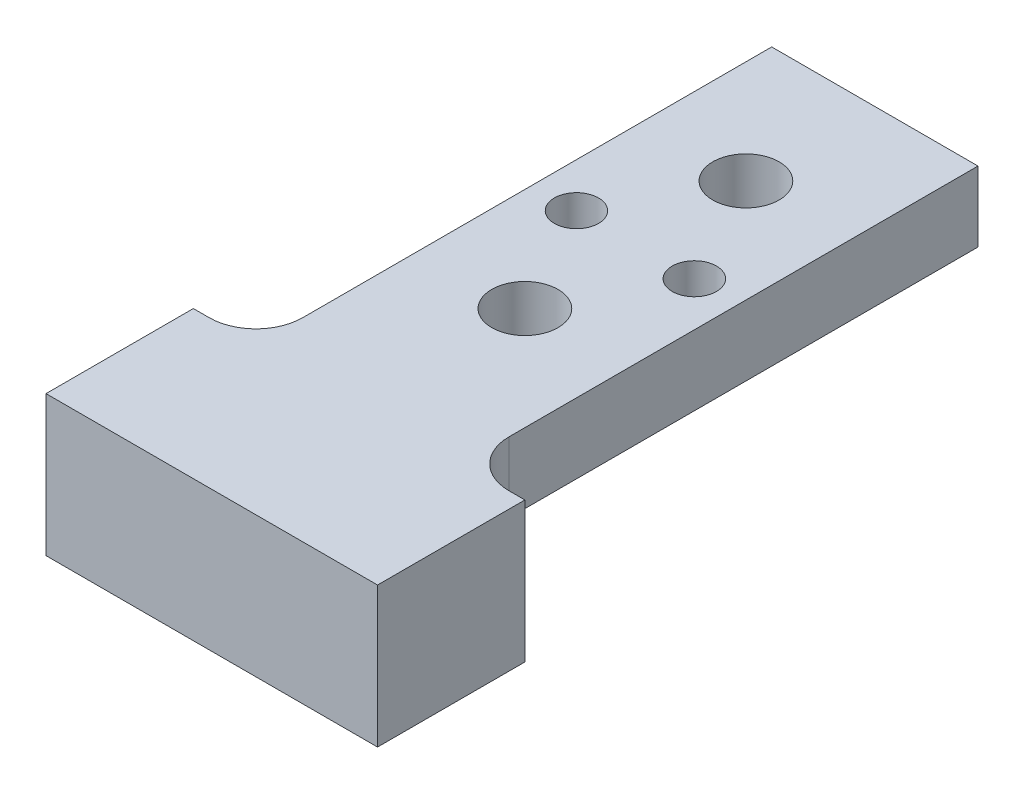
ISO-10303-21;
HEADER;
FILE_DESCRIPTION(('STEP AP214'),'2;1');
FILE_NAME('part.step','',(''),(''),'','','');
FILE_SCHEMA(('AUTOMOTIVE_DESIGN { 1 0 10303 214 1 1 1 1 }'));
ENDSEC;
DATA;
#1=APPLICATION_CONTEXT('core data for automotive mechanical design processes');
#2=APPLICATION_PROTOCOL_DEFINITION('international standard','automotive_design',2000,#1);
#3=PRODUCT_CONTEXT('',#1,'mechanical');
#4=PRODUCT('Part','Part','',(#3));
#5=PRODUCT_RELATED_PRODUCT_CATEGORY('part','',(#4));
#6=PRODUCT_DEFINITION_FORMATION('','',#4);
#7=PRODUCT_DEFINITION_CONTEXT('part definition',#1,'design');
#8=PRODUCT_DEFINITION('design','',#6,#7);
#9=PRODUCT_DEFINITION_SHAPE('','',#8);
#10=(LENGTH_UNIT() NAMED_UNIT(*) SI_UNIT(.MILLI.,.METRE.));
#11=(NAMED_UNIT(*) PLANE_ANGLE_UNIT() SI_UNIT($,.RADIAN.));
#12=(NAMED_UNIT(*) SI_UNIT($,.STERADIAN.) SOLID_ANGLE_UNIT());
#13=UNCERTAINTY_MEASURE_WITH_UNIT(LENGTH_MEASURE(1.E-05),#10,'distance_accuracy_value','');
#14=(GEOMETRIC_REPRESENTATION_CONTEXT(3) GLOBAL_UNCERTAINTY_ASSIGNED_CONTEXT((#13)) GLOBAL_UNIT_ASSIGNED_CONTEXT((#10,
#11,#12)) REPRESENTATION_CONTEXT('',''));
#15=CARTESIAN_POINT('',(0.,0.,0.));
#16=DIRECTION('',(0.,0.,1.));
#17=DIRECTION('',(1.,0.,0.));
#18=AXIS2_PLACEMENT_3D('',#15,#16,#17);
#19=CARTESIAN_POINT('',(-22.5,9.525,-45.));
#20=DIRECTION('',(1.,0.,0.));
#21=DIRECTION('',(0.,0.,-1.));
#22=AXIS2_PLACEMENT_3D('',#19,#20,#21);
#23=PLANE('',#22);
#24=DIRECTION('',(0.,0.,1.));
#25=VECTOR('',#24,1.);
#26=CARTESIAN_POINT('',(-22.5,9.525,-45.));
#27=LINE('',#26,#25);
#28=CARTESIAN_POINT('',(-22.5,9.525,25.));
#29=VERTEX_POINT('',#28);
#30=CARTESIAN_POINT('',(-22.5,9.525,45.));
#31=VERTEX_POINT('',#30);
#32=EDGE_CURVE('E150',#29,#31,#27,.T.);
#33=ORIENTED_EDGE('',*,*,#32,.F.);
#34=DIRECTION('',(0.,-1.,0.));
#35=VECTOR('',#34,1.);
#36=CARTESIAN_POINT('',(-22.5,-9.52500000000001,25.));
#37=LINE('',#36,#35);
#38=CARTESIAN_POINT('',(-22.5,-9.52500000000001,25.));
#39=VERTEX_POINT('',#38);
#40=EDGE_CURVE('E198',#29,#39,#37,.T.);
#41=ORIENTED_EDGE('',*,*,#40,.T.);
#42=DIRECTION('',(0.,0.,1.));
#43=VECTOR('',#42,1.);
#44=CARTESIAN_POINT('',(-22.5,-9.525,-45.));
#45=LINE('',#44,#43);
#46=CARTESIAN_POINT('',(-22.5,-9.525,45.));
#47=VERTEX_POINT('',#46);
#48=EDGE_CURVE('E143',#39,#47,#45,.T.);
#49=ORIENTED_EDGE('',*,*,#48,.T.);
#50=DIRECTION('',(0.,-1.,0.));
#51=VECTOR('',#50,1.);
#52=CARTESIAN_POINT('',(-22.5,9.525,45.));
#53=LINE('',#52,#51);
#54=EDGE_CURVE('E136',#31,#47,#53,.T.);
#55=ORIENTED_EDGE('',*,*,#54,.F.);
#56=EDGE_LOOP('',(#33,#41,#49,#55));
#57=FACE_BOUND('',#56,.T.);
#58=ADVANCED_FACE('F34',(#57),#23,.F.);
#59=CARTESIAN_POINT('',(-22.5,9.525,45.));
#60=DIRECTION('',(0.,0.,-1.));
#61=DIRECTION('',(-1.,0.,0.));
#62=AXIS2_PLACEMENT_3D('',#59,#60,#61);
#63=PLANE('',#62);
#64=DIRECTION('',(1.,0.,0.));
#65=VECTOR('',#64,1.);
#66=CARTESIAN_POINT('',(-22.5,-9.525,45.));
#67=LINE('',#66,#65);
#68=CARTESIAN_POINT('',(22.5,-9.525,45.));
#69=VERTEX_POINT('',#68);
#70=EDGE_CURVE('E145',#47,#69,#67,.T.);
#71=ORIENTED_EDGE('',*,*,#70,.T.);
#72=DIRECTION('',(0.,-1.,0.));
#73=VECTOR('',#72,1.);
#74=CARTESIAN_POINT('',(22.5,9.525,45.));
#75=LINE('',#74,#73);
#76=CARTESIAN_POINT('',(22.5,9.525,45.));
#77=VERTEX_POINT('',#76);
#78=EDGE_CURVE('E132',#77,#69,#75,.T.);
#79=ORIENTED_EDGE('',*,*,#78,.F.);
#80=DIRECTION('',(1.,0.,0.));
#81=VECTOR('',#80,1.);
#82=CARTESIAN_POINT('',(-22.5,9.525,45.));
#83=LINE('',#82,#81);
#84=EDGE_CURVE('E139',#31,#77,#83,.T.);
#85=ORIENTED_EDGE('',*,*,#84,.F.);
#86=ORIENTED_EDGE('',*,*,#54,.T.);
#87=EDGE_LOOP('',(#71,#79,#85,#86));
#88=FACE_BOUND('',#87,.T.);
#89=ADVANCED_FACE('F215',(#88),#63,.F.);
#90=CARTESIAN_POINT('',(22.5,9.525,-45.));
#91=DIRECTION('',(-1.,0.,0.));
#92=DIRECTION('',(0.,0.,1.));
#93=AXIS2_PLACEMENT_3D('',#90,#91,#92);
#94=PLANE('',#93);
#95=DIRECTION('',(0.,-1.,0.));
#96=VECTOR('',#95,1.);
#97=CARTESIAN_POINT('',(22.5,-9.52500000000001,25.));
#98=LINE('',#97,#96);
#99=CARTESIAN_POINT('',(22.5,9.525,25.));
#100=VERTEX_POINT('',#99);
#101=CARTESIAN_POINT('',(22.5,-9.525,25.));
#102=VERTEX_POINT('',#101);
#103=EDGE_CURVE('E197',#100,#102,#98,.T.);
#104=ORIENTED_EDGE('',*,*,#103,.F.);
#105=DIRECTION('',(0.,0.,-1.));
#106=VECTOR('',#105,1.);
#107=CARTESIAN_POINT('',(22.5,9.525,-45.));
#108=LINE('',#107,#106);
#109=EDGE_CURVE('E133',#77,#100,#108,.T.);
#110=ORIENTED_EDGE('',*,*,#109,.F.);
#111=ORIENTED_EDGE('',*,*,#78,.T.);
#112=DIRECTION('',(0.,0.,-1.));
#113=VECTOR('',#112,1.);
#114=CARTESIAN_POINT('',(22.5,-9.525,-45.));
#115=LINE('',#114,#113);
#116=EDGE_CURVE('E148',#69,#102,#115,.T.);
#117=ORIENTED_EDGE('',*,*,#116,.T.);
#118=EDGE_LOOP('',(#104,#110,#111,#117));
#119=FACE_BOUND('',#118,.T.);
#120=ADVANCED_FACE('F220',(#119),#94,.F.);
#121=CARTESIAN_POINT('',(-22.5,9.525,-45.));
#122=DIRECTION('',(0.,0.,1.));
#123=DIRECTION('',(1.,0.,0.));
#124=AXIS2_PLACEMENT_3D('',#121,#122,#123);
#125=PLANE('',#124);
#126=DIRECTION('',(-1.,0.,0.));
#127=VECTOR('',#126,1.);
#128=CARTESIAN_POINT('',(-22.5,9.525,-45.));
#129=LINE('',#128,#127);
#130=CARTESIAN_POINT('',(14.,9.525,-45.));
#131=VERTEX_POINT('',#130);
#132=CARTESIAN_POINT('',(-14.,9.525,-45.));
#133=VERTEX_POINT('',#132);
#134=EDGE_CURVE('E125',#131,#133,#129,.T.);
#135=ORIENTED_EDGE('',*,*,#134,.F.);
#136=DIRECTION('',(0.,1.,0.));
#137=VECTOR('',#136,1.);
#138=CARTESIAN_POINT('',(14.,-9.52500000000001,-45.));
#139=LINE('',#138,#137);
#140=CARTESIAN_POINT('',(14.,0.,-45.));
#141=VERTEX_POINT('',#140);
#142=EDGE_CURVE('E111',#141,#131,#139,.T.);
#143=ORIENTED_EDGE('',*,*,#142,.F.);
#144=DIRECTION('',(1.,0.,0.));
#145=VECTOR('',#144,1.);
#146=CARTESIAN_POINT('',(-22.5,0.,-45.));
#147=LINE('',#146,#145);
#148=CARTESIAN_POINT('',(-14.,0.,-45.));
#149=VERTEX_POINT('',#148);
#150=EDGE_CURVE('E201',#149,#141,#147,.T.);
#151=ORIENTED_EDGE('',*,*,#150,.F.);
#152=DIRECTION('',(0.,1.,0.));
#153=VECTOR('',#152,1.);
#154=CARTESIAN_POINT('',(-14.,-9.52500000000001,-45.));
#155=LINE('',#154,#153);
#156=EDGE_CURVE('E131',#149,#133,#155,.T.);
#157=ORIENTED_EDGE('',*,*,#156,.T.);
#158=EDGE_LOOP('',(#135,#143,#151,#157));
#159=FACE_BOUND('',#158,.T.);
#160=ADVANCED_FACE('F129',(#159),#125,.F.);
#161=CARTESIAN_POINT('',(-22.5,9.525,45.));
#162=DIRECTION('',(0.,1.,0.));
#163=DIRECTION('',(0.,0.,1.));
#164=AXIS2_PLACEMENT_3D('',#161,#162,#163);
#165=PLANE('',#164);
#166=CARTESIAN_POINT('',(-1.11022302462516E-13,9.525,-27.4999999999999));
#167=DIRECTION('',(0.,1.,0.));
#168=DIRECTION('',(0.,0.,1.));
#169=AXIS2_PLACEMENT_3D('',#166,#167,#168);
#170=CIRCLE('',#169,4.49999999999999);
#171=CARTESIAN_POINT('',(-1.11022302462516E-13,9.525,-22.9999999999999));
#172=VERTEX_POINT('',#171);
#173=EDGE_CURVE('E287',#172,#172,#170,.T.);
#174=ORIENTED_EDGE('',*,*,#173,.F.);
#175=EDGE_LOOP('',(#174));
#176=FACE_BOUND('',#175,.T.);
#177=CARTESIAN_POINT('',(-1.11022302462516E-13,9.525,2.50000000000011));
#178=DIRECTION('',(0.,1.,0.));
#179=DIRECTION('',(0.,0.,1.));
#180=AXIS2_PLACEMENT_3D('',#177,#178,#179);
#181=CIRCLE('',#180,4.49999999999999);
#182=CARTESIAN_POINT('',(-1.11022302462516E-13,9.525,7.0000000000001));
#183=VERTEX_POINT('',#182);
#184=EDGE_CURVE('E187',#183,#183,#181,.T.);
#185=ORIENTED_EDGE('',*,*,#184,.F.);
#186=EDGE_LOOP('',(#185));
#187=FACE_BOUND('',#186,.T.);
#188=CARTESIAN_POINT('',(7.9999999999999,9.525,-12.5));
#189=DIRECTION('',(0.,1.,0.));
#190=DIRECTION('',(0.,0.,1.));
#191=AXIS2_PLACEMENT_3D('',#188,#189,#190);
#192=CIRCLE('',#191,2.99999999999999);
#193=CARTESIAN_POINT('',(7.9999999999999,9.525,-9.50000000000002));
#194=VERTEX_POINT('',#193);
#195=EDGE_CURVE('E176',#194,#194,#192,.T.);
#196=ORIENTED_EDGE('',*,*,#195,.F.);
#197=EDGE_LOOP('',(#196));
#198=FACE_BOUND('',#197,.T.);
#199=CARTESIAN_POINT('',(-8.00000000000012,9.525,-12.5));
#200=DIRECTION('',(0.,1.,0.));
#201=DIRECTION('',(0.,0.,1.));
#202=AXIS2_PLACEMENT_3D('',#199,#200,#201);
#203=CIRCLE('',#202,2.99999999999999);
#204=CARTESIAN_POINT('',(-8.00000000000012,9.525,-9.50000000000002));
#205=VERTEX_POINT('',#204);
#206=EDGE_CURVE('E173',#205,#205,#203,.T.);
#207=ORIENTED_EDGE('',*,*,#206,.F.);
#208=EDGE_LOOP('',(#207));
#209=FACE_BOUND('',#208,.T.);
#210=DIRECTION('',(1.,0.,0.));
#211=VECTOR('',#210,1.);
#212=CARTESIAN_POINT('',(22.5,9.525,25.));
#213=LINE('',#212,#211);
#214=CARTESIAN_POINT('',(20.35,9.525,25.));
#215=VERTEX_POINT('',#214);
#216=EDGE_CURVE('E120',#215,#100,#213,.T.);
#217=ORIENTED_EDGE('',*,*,#216,.F.);
#218=CARTESIAN_POINT('',(20.35,9.525,18.65));
#219=DIRECTION('',(0.,1.,0.));
#220=DIRECTION('',(0.,0.,1.));
#221=AXIS2_PLACEMENT_3D('',#218,#219,#220);
#222=CIRCLE('',#221,6.35);
#223=CARTESIAN_POINT('',(14.,9.525,18.65));
#224=VERTEX_POINT('',#223);
#225=EDGE_CURVE('E43',#215,#224,#222,.F.);
#226=ORIENTED_EDGE('',*,*,#225,.T.);
#227=DIRECTION('',(0.,0.,1.));
#228=VECTOR('',#227,1.);
#229=CARTESIAN_POINT('',(14.,9.525,-45.));
#230=LINE('',#229,#228);
#231=EDGE_CURVE('E113',#131,#224,#230,.T.);
#232=ORIENTED_EDGE('',*,*,#231,.F.);
#233=ORIENTED_EDGE('',*,*,#134,.T.);
#234=DIRECTION('',(0.,0.,-1.));
#235=VECTOR('',#234,1.);
#236=CARTESIAN_POINT('',(-14.,9.525,-45.));
#237=LINE('',#236,#235);
#238=CARTESIAN_POINT('',(-14.,9.525,18.65));
#239=VERTEX_POINT('',#238);
#240=EDGE_CURVE('E194',#239,#133,#237,.T.);
#241=ORIENTED_EDGE('',*,*,#240,.F.);
#242=CARTESIAN_POINT('',(-20.35,9.525,18.65));
#243=DIRECTION('',(0.,1.,0.));
#244=DIRECTION('',(0.,0.,1.));
#245=AXIS2_PLACEMENT_3D('',#242,#243,#244);
#246=CIRCLE('',#245,6.35);
#247=CARTESIAN_POINT('',(-20.35,9.525,25.));
#248=VERTEX_POINT('',#247);
#249=EDGE_CURVE('E167',#239,#248,#246,.F.);
#250=ORIENTED_EDGE('',*,*,#249,.T.);
#251=DIRECTION('',(1.,0.,0.));
#252=VECTOR('',#251,1.);
#253=CARTESIAN_POINT('',(-22.5,9.525,25.));
#254=LINE('',#253,#252);
#255=EDGE_CURVE('E119',#29,#248,#254,.T.);
#256=ORIENTED_EDGE('',*,*,#255,.F.);
#257=ORIENTED_EDGE('',*,*,#32,.T.);
#258=ORIENTED_EDGE('',*,*,#84,.T.);
#259=ORIENTED_EDGE('',*,*,#109,.T.);
#260=EDGE_LOOP('',(#217,#226,#232,#233,#241,#250,#256,#257,#258,#259));
#261=FACE_BOUND('',#260,.T.);
#262=ADVANCED_FACE('F123',(#176,#187,#198,#209,#261),#165,.T.);
#263=CARTESIAN_POINT('',(-22.5,-9.525,45.));
#264=DIRECTION('',(0.,1.,0.));
#265=DIRECTION('',(0.,0.,1.));
#266=AXIS2_PLACEMENT_3D('',#263,#264,#265);
#267=PLANE('',#266);
#268=ORIENTED_EDGE('',*,*,#48,.F.);
#269=DIRECTION('',(1.,0.,0.));
#270=VECTOR('',#269,1.);
#271=CARTESIAN_POINT('',(-22.5,-9.52500000000001,25.));
#272=LINE('',#271,#270);
#273=EDGE_CURVE('E146',#39,#102,#272,.T.);
#274=ORIENTED_EDGE('',*,*,#273,.T.);
#275=ORIENTED_EDGE('',*,*,#116,.F.);
#276=ORIENTED_EDGE('',*,*,#70,.F.);
#277=EDGE_LOOP('',(#268,#274,#275,#276));
#278=FACE_BOUND('',#277,.T.);
#279=ADVANCED_FACE('F255',(#278),#267,.F.);
#280=CARTESIAN_POINT('',(-22.5,-9.52500000000001,25.));
#281=DIRECTION('',(0.,0.,1.));
#282=DIRECTION('',(1.,0.,0.));
#283=AXIS2_PLACEMENT_3D('',#280,#281,#282);
#284=PLANE('',#283);
#285=ORIENTED_EDGE('',*,*,#255,.T.);
#286=DIRECTION('',(0.,1.,0.));
#287=VECTOR('',#286,1.);
#288=CARTESIAN_POINT('',(-20.35,0.,25.));
#289=LINE('',#288,#287);
#290=CARTESIAN_POINT('',(-20.35,0.,25.));
#291=VERTEX_POINT('',#290);
#292=EDGE_CURVE('E163',#248,#291,#289,.F.);
#293=ORIENTED_EDGE('',*,*,#292,.T.);
#294=DIRECTION('',(1.,0.,0.));
#295=VECTOR('',#294,1.);
#296=CARTESIAN_POINT('',(-22.5,0.,25.));
#297=LINE('',#296,#295);
#298=CARTESIAN_POINT('',(20.35,0.,25.));
#299=VERTEX_POINT('',#298);
#300=EDGE_CURVE('E205',#291,#299,#297,.T.);
#301=ORIENTED_EDGE('',*,*,#300,.T.);
#302=DIRECTION('',(0.,1.,0.));
#303=VECTOR('',#302,1.);
#304=CARTESIAN_POINT('',(20.35,9.525,25.));
#305=LINE('',#304,#303);
#306=EDGE_CURVE('E160',#299,#215,#305,.T.);
#307=ORIENTED_EDGE('',*,*,#306,.T.);
#308=ORIENTED_EDGE('',*,*,#216,.T.);
#309=ORIENTED_EDGE('',*,*,#103,.T.);
#310=ORIENTED_EDGE('',*,*,#273,.F.);
#311=ORIENTED_EDGE('',*,*,#40,.F.);
#312=EDGE_LOOP('',(#285,#293,#301,#307,#308,#309,#310,#311));
#313=FACE_BOUND('',#312,.T.);
#314=ADVANCED_FACE('F222',(#313),#284,.F.);
#315=CARTESIAN_POINT('',(-22.5,0.,-45.));
#316=DIRECTION('',(0.,1.,0.));
#317=DIRECTION('',(0.,0.,1.));
#318=AXIS2_PLACEMENT_3D('',#315,#316,#317);
#319=PLANE('',#318);
#320=CARTESIAN_POINT('',(-1.11022302462516E-13,0.,-27.4999999999999));
#321=DIRECTION('',(0.,1.,0.));
#322=DIRECTION('',(0.,0.,1.));
#323=AXIS2_PLACEMENT_3D('',#320,#321,#322);
#324=CIRCLE('',#323,4.49999999999999);
#325=CARTESIAN_POINT('',(-1.11022302462516E-13,0.,-22.9999999999999));
#326=VERTEX_POINT('',#325);
#327=EDGE_CURVE('E38',#326,#326,#324,.T.);
#328=ORIENTED_EDGE('',*,*,#327,.T.);
#329=EDGE_LOOP('',(#328));
#330=FACE_BOUND('',#329,.T.);
#331=CARTESIAN_POINT('',(-1.11022302462516E-13,0.,2.50000000000011));
#332=DIRECTION('',(0.,1.,0.));
#333=DIRECTION('',(0.,0.,1.));
#334=AXIS2_PLACEMENT_3D('',#331,#332,#333);
#335=CIRCLE('',#334,4.49999999999999);
#336=CARTESIAN_POINT('',(-1.11022302462516E-13,0.,7.0000000000001));
#337=VERTEX_POINT('',#336);
#338=EDGE_CURVE('E182',#337,#337,#335,.T.);
#339=ORIENTED_EDGE('',*,*,#338,.T.);
#340=EDGE_LOOP('',(#339));
#341=FACE_BOUND('',#340,.T.);
#342=CARTESIAN_POINT('',(7.9999999999999,0.,-12.5));
#343=DIRECTION('',(0.,1.,0.));
#344=DIRECTION('',(0.,0.,1.));
#345=AXIS2_PLACEMENT_3D('',#342,#343,#344);
#346=CIRCLE('',#345,2.99999999999999);
#347=CARTESIAN_POINT('',(7.9999999999999,0.,-9.50000000000002));
#348=VERTEX_POINT('',#347);
#349=EDGE_CURVE('E174',#348,#348,#346,.T.);
#350=ORIENTED_EDGE('',*,*,#349,.T.);
#351=EDGE_LOOP('',(#350));
#352=FACE_BOUND('',#351,.T.);
#353=CARTESIAN_POINT('',(-8.00000000000012,0.,-12.5));
#354=DIRECTION('',(0.,1.,0.));
#355=DIRECTION('',(0.,0.,1.));
#356=AXIS2_PLACEMENT_3D('',#353,#354,#355);
#357=CIRCLE('',#356,2.99999999999999);
#358=CARTESIAN_POINT('',(-8.00000000000012,0.,-9.50000000000002));
#359=VERTEX_POINT('',#358);
#360=EDGE_CURVE('E127',#359,#359,#357,.T.);
#361=ORIENTED_EDGE('',*,*,#360,.T.);
#362=EDGE_LOOP('',(#361));
#363=FACE_BOUND('',#362,.T.);
#364=ORIENTED_EDGE('',*,*,#150,.T.);
#365=DIRECTION('',(0.,0.,1.));
#366=VECTOR('',#365,1.);
#367=CARTESIAN_POINT('',(14.,0.,-45.));
#368=LINE('',#367,#366);
#369=CARTESIAN_POINT('',(14.,0.,18.65));
#370=VERTEX_POINT('',#369);
#371=EDGE_CURVE('E114',#141,#370,#368,.T.);
#372=ORIENTED_EDGE('',*,*,#371,.T.);
#373=CARTESIAN_POINT('',(20.35,0.,18.65));
#374=DIRECTION('',(0.,1.,0.));
#375=DIRECTION('',(0.,0.,1.));
#376=AXIS2_PLACEMENT_3D('',#373,#374,#375);
#377=CIRCLE('',#376,6.35);
#378=EDGE_CURVE('E11',#370,#299,#377,.T.);
#379=ORIENTED_EDGE('',*,*,#378,.T.);
#380=ORIENTED_EDGE('',*,*,#300,.F.);
#381=CARTESIAN_POINT('',(-20.35,0.,18.65));
#382=DIRECTION('',(0.,1.,0.));
#383=DIRECTION('',(0.,0.,1.));
#384=AXIS2_PLACEMENT_3D('',#381,#382,#383);
#385=CIRCLE('',#384,6.35);
#386=CARTESIAN_POINT('',(-14.,0.,18.65));
#387=VERTEX_POINT('',#386);
#388=EDGE_CURVE('E169',#291,#387,#385,.T.);
#389=ORIENTED_EDGE('',*,*,#388,.T.);
#390=DIRECTION('',(0.,0.,-1.));
#391=VECTOR('',#390,1.);
#392=CARTESIAN_POINT('',(-14.,0.,-45.));
#393=LINE('',#392,#391);
#394=EDGE_CURVE('E154',#387,#149,#393,.T.);
#395=ORIENTED_EDGE('',*,*,#394,.T.);
#396=EDGE_LOOP('',(#364,#372,#379,#380,#389,#395));
#397=FACE_BOUND('',#396,.T.);
#398=ADVANCED_FACE('F227',(#330,#341,#352,#363,#397),#319,.F.);
#399=CARTESIAN_POINT('',(-14.,-9.52500000000001,-45.));
#400=DIRECTION('',(1.,0.,0.));
#401=DIRECTION('',(0.,0.,-1.));
#402=AXIS2_PLACEMENT_3D('',#399,#400,#401);
#403=PLANE('',#402);
#404=ORIENTED_EDGE('',*,*,#394,.F.);
#405=DIRECTION('',(0.,1.,0.));
#406=VECTOR('',#405,1.);
#407=CARTESIAN_POINT('',(-14.,9.525,18.65));
#408=LINE('',#407,#406);
#409=EDGE_CURVE('E157',#387,#239,#408,.T.);
#410=ORIENTED_EDGE('',*,*,#409,.T.);
#411=ORIENTED_EDGE('',*,*,#240,.T.);
#412=ORIENTED_EDGE('',*,*,#156,.F.);
#413=EDGE_LOOP('',(#404,#410,#411,#412));
#414=FACE_BOUND('',#413,.T.);
#415=ADVANCED_FACE('F232',(#414),#403,.F.);
#416=CARTESIAN_POINT('',(14.,-9.52500000000001,-45.));
#417=DIRECTION('',(-1.,0.,0.));
#418=DIRECTION('',(0.,0.,1.));
#419=AXIS2_PLACEMENT_3D('',#416,#417,#418);
#420=PLANE('',#419);
#421=ORIENTED_EDGE('',*,*,#231,.T.);
#422=DIRECTION('',(0.,1.,0.));
#423=VECTOR('',#422,1.);
#424=CARTESIAN_POINT('',(14.,0.,18.65));
#425=LINE('',#424,#423);
#426=EDGE_CURVE('E51',#224,#370,#425,.F.);
#427=ORIENTED_EDGE('',*,*,#426,.T.);
#428=ORIENTED_EDGE('',*,*,#371,.F.);
#429=ORIENTED_EDGE('',*,*,#142,.T.);
#430=EDGE_LOOP('',(#421,#427,#428,#429));
#431=FACE_BOUND('',#430,.T.);
#432=ADVANCED_FACE('F112',(#431),#420,.F.);
#433=CARTESIAN_POINT('',(-20.35,-9.52500000000001,18.65));
#434=DIRECTION('',(0.,-1.,0.));
#435=DIRECTION('',(0.,0.,-1.));
#436=AXIS2_PLACEMENT_3D('',#433,#434,#435);
#437=CYLINDRICAL_SURFACE('',#436,6.35);
#438=ORIENTED_EDGE('',*,*,#388,.F.);
#439=ORIENTED_EDGE('',*,*,#292,.F.);
#440=ORIENTED_EDGE('',*,*,#249,.F.);
#441=ORIENTED_EDGE('',*,*,#409,.F.);
#442=EDGE_LOOP('',(#438,#439,#440,#441));
#443=FACE_BOUND('',#442,.T.);
#444=ADVANCED_FACE('F235',(#443),#437,.F.);
#445=CARTESIAN_POINT('',(20.35,-9.52500000000001,18.65));
#446=DIRECTION('',(0.,-1.,0.));
#447=DIRECTION('',(0.,0.,-1.));
#448=AXIS2_PLACEMENT_3D('',#445,#446,#447);
#449=CYLINDRICAL_SURFACE('',#448,6.35);
#450=ORIENTED_EDGE('',*,*,#378,.F.);
#451=ORIENTED_EDGE('',*,*,#426,.F.);
#452=ORIENTED_EDGE('',*,*,#225,.F.);
#453=ORIENTED_EDGE('',*,*,#306,.F.);
#454=EDGE_LOOP('',(#450,#451,#452,#453));
#455=FACE_BOUND('',#454,.T.);
#456=ADVANCED_FACE('F36',(#455),#449,.F.);
#457=CARTESIAN_POINT('',(-8.00000000000012,9.525,-12.5));
#458=DIRECTION('',(0.,1.,0.));
#459=DIRECTION('',(0.,0.,1.));
#460=AXIS2_PLACEMENT_3D('',#457,#458,#459);
#461=CYLINDRICAL_SURFACE('',#460,2.99999999999999);
#462=ORIENTED_EDGE('',*,*,#206,.T.);
#463=EDGE_LOOP('',(#462));
#464=FACE_BOUND('',#463,.T.);
#465=ORIENTED_EDGE('',*,*,#360,.F.);
#466=EDGE_LOOP('',(#465));
#467=FACE_BOUND('',#466,.T.);
#468=ADVANCED_FACE('F241',(#464,#467),#461,.F.);
#469=CARTESIAN_POINT('',(7.9999999999999,9.525,-12.5));
#470=DIRECTION('',(0.,1.,0.));
#471=DIRECTION('',(0.,0.,1.));
#472=AXIS2_PLACEMENT_3D('',#469,#470,#471);
#473=CYLINDRICAL_SURFACE('',#472,2.99999999999999);
#474=ORIENTED_EDGE('',*,*,#195,.T.);
#475=EDGE_LOOP('',(#474));
#476=FACE_BOUND('',#475,.T.);
#477=ORIENTED_EDGE('',*,*,#349,.F.);
#478=EDGE_LOOP('',(#477));
#479=FACE_BOUND('',#478,.T.);
#480=ADVANCED_FACE('F271',(#476,#479),#473,.F.);
#481=CARTESIAN_POINT('',(-1.11022302462516E-13,9.525,2.50000000000011));
#482=DIRECTION('',(0.,1.,0.));
#483=DIRECTION('',(0.,0.,1.));
#484=AXIS2_PLACEMENT_3D('',#481,#482,#483);
#485=CYLINDRICAL_SURFACE('',#484,4.49999999999999);
#486=ORIENTED_EDGE('',*,*,#184,.T.);
#487=EDGE_LOOP('',(#486));
#488=FACE_BOUND('',#487,.T.);
#489=ORIENTED_EDGE('',*,*,#338,.F.);
#490=EDGE_LOOP('',(#489));
#491=FACE_BOUND('',#490,.T.);
#492=ADVANCED_FACE('F275',(#488,#491),#485,.F.);
#493=CARTESIAN_POINT('',(-1.11022302462516E-13,9.525,-27.4999999999999));
#494=DIRECTION('',(0.,1.,0.));
#495=DIRECTION('',(0.,0.,1.));
#496=AXIS2_PLACEMENT_3D('',#493,#494,#495);
#497=CYLINDRICAL_SURFACE('',#496,4.49999999999999);
#498=ORIENTED_EDGE('',*,*,#173,.T.);
#499=EDGE_LOOP('',(#498));
#500=FACE_BOUND('',#499,.T.);
#501=ORIENTED_EDGE('',*,*,#327,.F.);
#502=EDGE_LOOP('',(#501));
#503=FACE_BOUND('',#502,.T.);
#504=ADVANCED_FACE('F278',(#500,#503),#497,.F.);
#505=CLOSED_SHELL('',(#58,#89,#120,#160,#262,#279,#314,#398,#415,#432,#444,#456,#468,#480,#492,#504));
#506=MANIFOLD_SOLID_BREP('B2',#505);
#507=ADVANCED_BREP_SHAPE_REPRESENTATION('',(#18,#506),#14);
#508=SHAPE_DEFINITION_REPRESENTATION(#9,#507);
ENDSEC;
END-ISO-10303-21;
